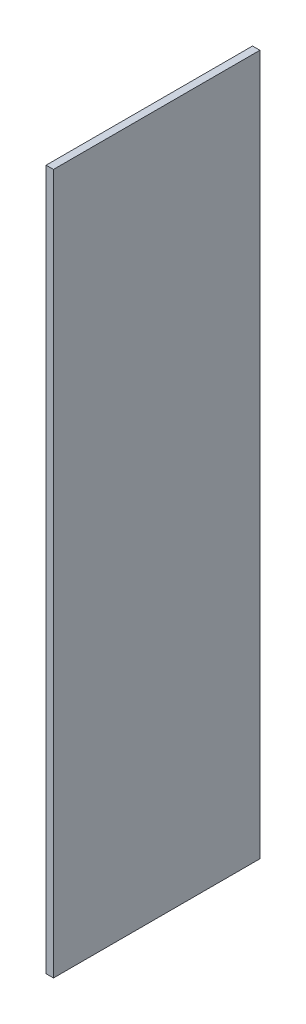
ISO-10303-21;
HEADER;
FILE_DESCRIPTION(('STEP AP214'),'2;1');
FILE_NAME('part.step','',(''),(''),'','','');
FILE_SCHEMA(('AUTOMOTIVE_DESIGN { 1 0 10303 214 1 1 1 1 }'));
ENDSEC;
DATA;
#1=APPLICATION_CONTEXT('core data for automotive mechanical design processes');
#2=APPLICATION_PROTOCOL_DEFINITION('international standard','automotive_design',2000,#1);
#3=PRODUCT_CONTEXT('',#1,'mechanical');
#4=PRODUCT('Part','Part','',(#3));
#5=PRODUCT_RELATED_PRODUCT_CATEGORY('part','',(#4));
#6=PRODUCT_DEFINITION_FORMATION('','',#4);
#7=PRODUCT_DEFINITION_CONTEXT('part definition',#1,'design');
#8=PRODUCT_DEFINITION('design','',#6,#7);
#9=PRODUCT_DEFINITION_SHAPE('','',#8);
#10=(LENGTH_UNIT() NAMED_UNIT(*) SI_UNIT(.MILLI.,.METRE.));
#11=(NAMED_UNIT(*) PLANE_ANGLE_UNIT() SI_UNIT($,.RADIAN.));
#12=(NAMED_UNIT(*) SI_UNIT($,.STERADIAN.) SOLID_ANGLE_UNIT());
#13=UNCERTAINTY_MEASURE_WITH_UNIT(LENGTH_MEASURE(1.E-05),#10,'distance_accuracy_value','');
#14=(GEOMETRIC_REPRESENTATION_CONTEXT(3) GLOBAL_UNCERTAINTY_ASSIGNED_CONTEXT((#13)) GLOBAL_UNIT_ASSIGNED_CONTEXT((#10,
#11,#12)) REPRESENTATION_CONTEXT('',''));
#15=CARTESIAN_POINT('',(0.,0.,0.));
#16=DIRECTION('',(0.,0.,1.));
#17=DIRECTION('',(1.,0.,0.));
#18=AXIS2_PLACEMENT_3D('',#15,#16,#17);
#19=CARTESIAN_POINT('',(10.,475.,140.));
#20=DIRECTION('',(0.,-1.,0.));
#21=DIRECTION('',(0.,0.,-1.));
#22=AXIS2_PLACEMENT_3D('',#19,#20,#21);
#23=PLANE('',#22);
#24=DIRECTION('',(0.,0.,1.));
#25=VECTOR('',#24,1.);
#26=CARTESIAN_POINT('',(0.,475.,140.));
#27=LINE('',#26,#25);
#28=CARTESIAN_POINT('',(0.,475.,-140.));
#29=VERTEX_POINT('',#28);
#30=CARTESIAN_POINT('',(0.,475.,140.));
#31=VERTEX_POINT('',#30);
#32=EDGE_CURVE('E102',#29,#31,#27,.T.);
#33=ORIENTED_EDGE('',*,*,#32,.T.);
#34=DIRECTION('',(-1.,0.,0.));
#35=VECTOR('',#34,1.);
#36=CARTESIAN_POINT('',(10.,475.,140.));
#37=LINE('',#36,#35);
#38=CARTESIAN_POINT('',(10.,475.,140.));
#39=VERTEX_POINT('',#38);
#40=EDGE_CURVE('E11',#39,#31,#37,.T.);
#41=ORIENTED_EDGE('',*,*,#40,.F.);
#42=DIRECTION('',(0.,0.,1.));
#43=VECTOR('',#42,1.);
#44=CARTESIAN_POINT('',(10.,475.,140.));
#45=LINE('',#44,#43);
#46=CARTESIAN_POINT('',(10.,475.,-140.));
#47=VERTEX_POINT('',#46);
#48=EDGE_CURVE('E90',#47,#39,#45,.T.);
#49=ORIENTED_EDGE('',*,*,#48,.F.);
#50=DIRECTION('',(-1.,0.,0.));
#51=VECTOR('',#50,1.);
#52=CARTESIAN_POINT('',(10.,475.,-140.));
#53=LINE('',#52,#51);
#54=EDGE_CURVE('E98',#47,#29,#53,.T.);
#55=ORIENTED_EDGE('',*,*,#54,.T.);
#56=EDGE_LOOP('',(#33,#41,#49,#55));
#57=FACE_BOUND('',#56,.T.);
#58=ADVANCED_FACE('F39',(#57),#23,.F.);
#59=CARTESIAN_POINT('',(10.,-475.,140.));
#60=DIRECTION('',(0.,0.,-1.));
#61=DIRECTION('',(-1.,0.,0.));
#62=AXIS2_PLACEMENT_3D('',#59,#60,#61);
#63=PLANE('',#62);
#64=DIRECTION('',(0.,-1.,0.));
#65=VECTOR('',#64,1.);
#66=CARTESIAN_POINT('',(0.,-475.,140.));
#67=LINE('',#66,#65);
#68=CARTESIAN_POINT('',(0.,-475.,140.));
#69=VERTEX_POINT('',#68);
#70=EDGE_CURVE('E94',#31,#69,#67,.T.);
#71=ORIENTED_EDGE('',*,*,#70,.T.);
#72=DIRECTION('',(-1.,0.,0.));
#73=VECTOR('',#72,1.);
#74=CARTESIAN_POINT('',(10.,-475.,140.));
#75=LINE('',#74,#73);
#76=CARTESIAN_POINT('',(10.,-475.,140.));
#77=VERTEX_POINT('',#76);
#78=EDGE_CURVE('E47',#77,#69,#75,.T.);
#79=ORIENTED_EDGE('',*,*,#78,.F.);
#80=DIRECTION('',(0.,-1.,0.));
#81=VECTOR('',#80,1.);
#82=CARTESIAN_POINT('',(10.,-475.,140.));
#83=LINE('',#82,#81);
#84=EDGE_CURVE('E85',#39,#77,#83,.T.);
#85=ORIENTED_EDGE('',*,*,#84,.F.);
#86=ORIENTED_EDGE('',*,*,#40,.T.);
#87=EDGE_LOOP('',(#71,#79,#85,#86));
#88=FACE_BOUND('',#87,.T.);
#89=ADVANCED_FACE('F93',(#88),#63,.F.);
#90=CARTESIAN_POINT('',(10.,-475.,140.));
#91=DIRECTION('',(0.,1.,0.));
#92=DIRECTION('',(0.,0.,1.));
#93=AXIS2_PLACEMENT_3D('',#90,#91,#92);
#94=PLANE('',#93);
#95=DIRECTION('',(0.,0.,-1.));
#96=VECTOR('',#95,1.);
#97=CARTESIAN_POINT('',(0.,-475.,140.));
#98=LINE('',#97,#96);
#99=CARTESIAN_POINT('',(0.,-475.,-140.));
#100=VERTEX_POINT('',#99);
#101=EDGE_CURVE('E72',#69,#100,#98,.T.);
#102=ORIENTED_EDGE('',*,*,#101,.T.);
#103=DIRECTION('',(-1.,0.,0.));
#104=VECTOR('',#103,1.);
#105=CARTESIAN_POINT('',(10.,-475.,-140.));
#106=LINE('',#105,#104);
#107=CARTESIAN_POINT('',(10.,-475.,-140.));
#108=VERTEX_POINT('',#107);
#109=EDGE_CURVE('E95',#108,#100,#106,.T.);
#110=ORIENTED_EDGE('',*,*,#109,.F.);
#111=DIRECTION('',(0.,0.,-1.));
#112=VECTOR('',#111,1.);
#113=CARTESIAN_POINT('',(10.,-475.,140.));
#114=LINE('',#113,#112);
#115=EDGE_CURVE('E88',#77,#108,#114,.T.);
#116=ORIENTED_EDGE('',*,*,#115,.F.);
#117=ORIENTED_EDGE('',*,*,#78,.T.);
#118=EDGE_LOOP('',(#102,#110,#116,#117));
#119=FACE_BOUND('',#118,.T.);
#120=ADVANCED_FACE('F96',(#119),#94,.F.);
#121=CARTESIAN_POINT('',(10.,-475.,-140.));
#122=DIRECTION('',(0.,0.,1.));
#123=DIRECTION('',(1.,0.,0.));
#124=AXIS2_PLACEMENT_3D('',#121,#122,#123);
#125=PLANE('',#124);
#126=DIRECTION('',(0.,1.,0.));
#127=VECTOR('',#126,1.);
#128=CARTESIAN_POINT('',(0.,-475.,-140.));
#129=LINE('',#128,#127);
#130=EDGE_CURVE('E78',#100,#29,#129,.T.);
#131=ORIENTED_EDGE('',*,*,#130,.T.);
#132=ORIENTED_EDGE('',*,*,#54,.F.);
#133=DIRECTION('',(0.,1.,0.));
#134=VECTOR('',#133,1.);
#135=CARTESIAN_POINT('',(10.,-475.,-140.));
#136=LINE('',#135,#134);
#137=EDGE_CURVE('E55',#108,#47,#136,.T.);
#138=ORIENTED_EDGE('',*,*,#137,.F.);
#139=ORIENTED_EDGE('',*,*,#109,.T.);
#140=EDGE_LOOP('',(#131,#132,#138,#139));
#141=FACE_BOUND('',#140,.T.);
#142=ADVANCED_FACE('F109',(#141),#125,.F.);
#143=CARTESIAN_POINT('',(10.,0.,0.));
#144=DIRECTION('',(1.,0.,0.));
#145=DIRECTION('',(0.,0.,-1.));
#146=AXIS2_PLACEMENT_3D('',#143,#144,#145);
#147=PLANE('',#146);
#148=ORIENTED_EDGE('',*,*,#48,.T.);
#149=ORIENTED_EDGE('',*,*,#84,.T.);
#150=ORIENTED_EDGE('',*,*,#115,.T.);
#151=ORIENTED_EDGE('',*,*,#137,.T.);
#152=EDGE_LOOP('',(#148,#149,#150,#151));
#153=FACE_BOUND('',#152,.T.);
#154=ADVANCED_FACE('F86',(#153),#147,.T.);
#155=CARTESIAN_POINT('',(0.,0.,0.));
#156=DIRECTION('',(1.,0.,0.));
#157=DIRECTION('',(0.,0.,-1.));
#158=AXIS2_PLACEMENT_3D('',#155,#156,#157);
#159=PLANE('',#158);
#160=ORIENTED_EDGE('',*,*,#32,.F.);
#161=ORIENTED_EDGE('',*,*,#130,.F.);
#162=ORIENTED_EDGE('',*,*,#101,.F.);
#163=ORIENTED_EDGE('',*,*,#70,.F.);
#164=EDGE_LOOP('',(#160,#161,#162,#163));
#165=FACE_BOUND('',#164,.T.);
#166=ADVANCED_FACE('F112',(#165),#159,.F.);
#167=CLOSED_SHELL('',(#58,#89,#120,#142,#154,#166));
#168=MANIFOLD_SOLID_BREP('B2',#167);
#169=ADVANCED_BREP_SHAPE_REPRESENTATION('',(#18,#168),#14);
#170=SHAPE_DEFINITION_REPRESENTATION(#9,#169);
ENDSEC;
END-ISO-10303-21;
